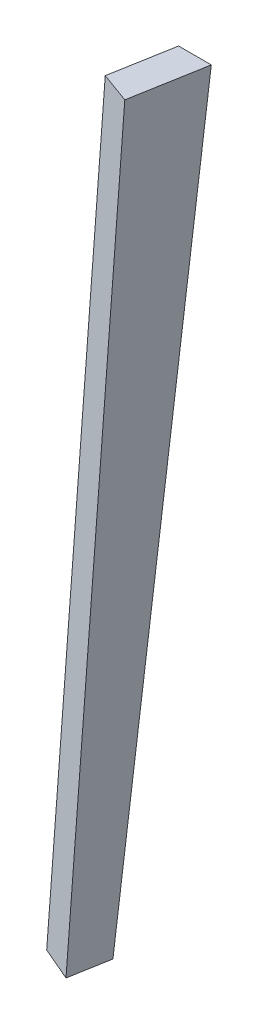
ISO-10303-21;
HEADER;
FILE_DESCRIPTION(('STEP AP214'),'2;1');
FILE_NAME('part.step','',(''),(''),'','','');
FILE_SCHEMA(('AUTOMOTIVE_DESIGN { 1 0 10303 214 1 1 1 1 }'));
ENDSEC;
DATA;
#1=APPLICATION_CONTEXT('core data for automotive mechanical design processes');
#2=APPLICATION_PROTOCOL_DEFINITION('international standard','automotive_design',2000,#1);
#3=PRODUCT_CONTEXT('',#1,'mechanical');
#4=PRODUCT('Part','Part','',(#3));
#5=PRODUCT_RELATED_PRODUCT_CATEGORY('part','',(#4));
#6=PRODUCT_DEFINITION_FORMATION('','',#4);
#7=PRODUCT_DEFINITION_CONTEXT('part definition',#1,'design');
#8=PRODUCT_DEFINITION('design','',#6,#7);
#9=PRODUCT_DEFINITION_SHAPE('','',#8);
#10=(LENGTH_UNIT() NAMED_UNIT(*) SI_UNIT(.MILLI.,.METRE.));
#11=(NAMED_UNIT(*) PLANE_ANGLE_UNIT() SI_UNIT($,.RADIAN.));
#12=(NAMED_UNIT(*) SI_UNIT($,.STERADIAN.) SOLID_ANGLE_UNIT());
#13=UNCERTAINTY_MEASURE_WITH_UNIT(LENGTH_MEASURE(1.E-05),#10,'distance_accuracy_value','');
#14=(GEOMETRIC_REPRESENTATION_CONTEXT(3) GLOBAL_UNCERTAINTY_ASSIGNED_CONTEXT((#13)) GLOBAL_UNIT_ASSIGNED_CONTEXT((#10,
#11,#12)) REPRESENTATION_CONTEXT('',''));
#15=CARTESIAN_POINT('',(0.,0.,0.));
#16=DIRECTION('',(0.,0.,1.));
#17=DIRECTION('',(1.,0.,0.));
#18=AXIS2_PLACEMENT_3D('',#15,#16,#17);
#19=CARTESIAN_POINT('',(0.,0.,0.));
#20=DIRECTION('',(0.,1.,0.));
#21=DIRECTION('',(0.,0.,1.));
#22=AXIS2_PLACEMENT_3D('',#19,#20,#21);
#23=PLANE('',#22);
#24=DIRECTION('',(0.17364817766693,0.,-0.984807753012208));
#25=VECTOR('',#24,1.);
#26=CARTESIAN_POINT('',(105.239300408618,0.,18.5565280929227));
#27=LINE('',#26,#25);
#28=CARTESIAN_POINT('',(101.967283837562,0.,37.1130561858436));
#29=VERTEX_POINT('',#28);
#30=CARTESIAN_POINT('',(108.511316979675,0.,0.));
#31=VERTEX_POINT('',#30);
#32=EDGE_CURVE('E335',#29,#31,#27,.T.);
#33=ORIENTED_EDGE('',*,*,#32,.F.);
#34=DIRECTION('',(0.939692620785915,0.,0.342020143325652));
#35=VECTOR('',#34,1.);
#36=CARTESIAN_POINT('',(0.,0.,0.));
#37=LINE('',#36,#35);
#38=CARTESIAN_POINT('',(120.270012490573,0.,43.7747046213905));
#39=VERTEX_POINT('',#38);
#40=EDGE_CURVE('E469',#29,#39,#37,.T.);
#41=ORIENTED_EDGE('',*,*,#40,.T.);
#42=DIRECTION('',(0.17364817766693,0.,-0.984807753012208));
#43=VECTOR('',#42,1.);
#44=CARTESIAN_POINT('',(120.270012490573,0.,43.7747046213928));
#45=LINE('',#44,#43);
#46=CARTESIAN_POINT('',(127.988673987868,0.,0.));
#47=VERTEX_POINT('',#46);
#48=EDGE_CURVE('E275',#39,#47,#45,.T.);
#49=ORIENTED_EDGE('',*,*,#48,.T.);
#50=DIRECTION('',(1.,0.,0.));
#51=VECTOR('',#50,1.);
#52=CARTESIAN_POINT('',(0.,0.,0.));
#53=LINE('',#52,#51);
#54=EDGE_CURVE('E466',#31,#47,#53,.T.);
#55=ORIENTED_EDGE('',*,*,#54,.F.);
#56=EDGE_LOOP('',(#33,#41,#49,#55));
#57=FACE_BOUND('',#56,.T.);
#58=ADVANCED_FACE('F270',(#57),#23,.T.);
#59=CARTESIAN_POINT('',(65.2241459166728,-490.22,23.7396476691044));
#60=DIRECTION('',(-0.281961204181753,0.358874635001233,0.889779116235657));
#61=DIRECTION('',(0.,-0.927407945093546,0.374051471561558));
#62=AXIS2_PLACEMENT_3D('',#59,#60,#61);
#63=PLANE('',#62);
#64=DIRECTION('',(-0.932643400292468,0.115073051020934,-0.341956840580265));
#65=VECTOR('',#64,1.);
#66=CARTESIAN_POINT('',(65.2241459166728,-490.22,23.7396476691044));
#67=LINE('',#66,#65);
#68=CARTESIAN_POINT('',(65.2241459166727,-490.22,23.7396476691031));
#69=VERTEX_POINT('',#68);
#70=CARTESIAN_POINT('',(47.1794403675953,-487.993576351202,17.1234956684268));
#71=VERTEX_POINT('',#70);
#72=EDGE_CURVE('E473',#69,#71,#67,.T.);
#73=ORIENTED_EDGE('',*,*,#72,.F.);
#74=DIRECTION('',(-0.934089828379049,0.109037536951291,-0.339980893660796));
#75=VECTOR('',#74,1.);
#76=CARTESIAN_POINT('',(65.2241459166728,-490.22,23.7396476691044));
#77=LINE('',#76,#75);
#78=CARTESIAN_POINT('',(47.1582170860149,-488.111140313721,17.1641873203734));
#79=VERTEX_POINT('',#78);
#80=EDGE_CURVE('E476',#69,#79,#77,.T.);
#81=ORIENTED_EDGE('',*,*,#80,.T.);
#82=DIRECTION('',(-0.16816608311874,-0.931536954726838,0.322426845139714));
#83=VECTOR('',#82,1.);
#84=CARTESIAN_POINT('',(126.83878852708,-46.7296471222864,-135.608326567175));
#85=LINE('',#84,#83);
#86=EDGE_CURVE('E328',#79,#71,#85,.F.);
#87=ORIENTED_EDGE('',*,*,#86,.T.);
#88=EDGE_LOOP('',(#73,#81,#87));
#89=FACE_BOUND('',#88,.T.);
#90=ADVANCED_FACE('F386',(#89),#63,.F.);
#91=CARTESIAN_POINT('',(50.1907524089899,-487.993576351202,0.0454964348697556));
#92=DIRECTION('',(0.0393655179455979,0.358874635001234,-0.932555281122576));
#93=DIRECTION('',(0.,0.933278686346146,0.359153022557255));
#94=AXIS2_PLACEMENT_3D('',#91,#92,#93);
#95=PLANE('',#94);
#96=DIRECTION('',(0.0477479515864214,0.931536954726839,0.360498314971858));
#97=VECTOR('',#96,1.);
#98=CARTESIAN_POINT('',(72.0727953943906,-61.0866409001997,165.255507802604));
#99=LINE('',#98,#97);
#100=CARTESIAN_POINT('',(50.1907524089899,-487.993576351202,0.0454964348697556));
#101=VERTEX_POINT('',#100);
#102=CARTESIAN_POINT('',(50.1847264125309,-488.111140313719,0.));
#103=VERTEX_POINT('',#102);
#104=EDGE_CURVE('E324',#101,#103,#99,.F.);
#105=ORIENTED_EDGE('',*,*,#104,.T.);
#106=DIRECTION('',(0.994037632856825,-0.109037536951274,0.));
#107=VECTOR('',#106,1.);
#108=CARTESIAN_POINT('',(50.1779383107974,-488.110395716263,3.5015664413135E-13));
#109=LINE('',#108,#107);
#110=CARTESIAN_POINT('',(69.4100863132487,-490.22,0.));
#111=VERTEX_POINT('',#110);
#112=EDGE_CURVE('E13',#103,#111,#109,.T.);
#113=ORIENTED_EDGE('',*,*,#112,.T.);
#114=DIRECTION('',(0.993354248705965,-0.115073051020934,-0.00235149028077553));
#115=VECTOR('',#114,1.);
#116=CARTESIAN_POINT('',(50.1907524089899,-487.993576351202,0.0454964348697556));
#117=LINE('',#116,#115);
#118=EDGE_CURVE('E326',#101,#111,#117,.T.);
#119=ORIENTED_EDGE('',*,*,#118,.F.);
#120=EDGE_LOOP('',(#105,#113,#119));
#121=FACE_BOUND('',#120,.T.);
#122=ADVANCED_FACE('F325',(#121),#95,.F.);
#123=CARTESIAN_POINT('',(109.356654261199,2.22642364879821,-3.28532778290395));
#124=DIRECTION('',(0.978058778302791,-0.116872632482846,0.172458151333541));
#125=DIRECTION('',(-0.17364817766693,0.,0.984807753012208));
#126=AXIS2_PLACEMENT_3D('',#123,#124,#125);
#127=PLANE('',#126);
#128=ORIENTED_EDGE('',*,*,#86,.F.);
#129=DIRECTION('',(-0.111494895555236,-0.992936093134445,-0.0405808232547251));
#130=VECTOR('',#129,1.);
#131=CARTESIAN_POINT('',(102.122838595063,1.38531842568085,37.1696734873746));
#132=LINE('',#131,#130);
#133=EDGE_CURVE('E337',#29,#79,#132,.T.);
#134=ORIENTED_EDGE('',*,*,#133,.F.);
#135=ORIENTED_EDGE('',*,*,#32,.T.);
#136=DIRECTION('',(-0.118650389594406,-0.992936093134445,0.));
#137=VECTOR('',#136,1.);
#138=CARTESIAN_POINT('',(108.676854895011,1.38531842568087,0.));
#139=LINE('',#138,#137);
#140=EDGE_CURVE('E320',#31,#103,#139,.T.);
#141=ORIENTED_EDGE('',*,*,#140,.T.);
#142=ORIENTED_EDGE('',*,*,#104,.F.);
#143=DIRECTION('',(0.17364817766693,0.,-0.984807753012208));
#144=VECTOR('',#143,1.);
#145=CARTESIAN_POINT('',(47.1794403675953,-487.993576351202,17.1234956684268));
#146=LINE('',#145,#144);
#147=EDGE_CURVE('E294',#71,#101,#146,.T.);
#148=ORIENTED_EDGE('',*,*,#147,.F.);
#149=EDGE_LOOP('',(#128,#134,#135,#141,#142,#148));
#150=FACE_BOUND('',#149,.T.);
#151=ADVANCED_FACE('F332',(#150),#127,.F.);
#152=CARTESIAN_POINT('',(127.988673987868,0.,0.));
#153=DIRECTION('',(0.978058778302791,-0.116872632482846,0.172458151333541));
#154=DIRECTION('',(-0.17364817766693,0.,0.984807753012208));
#155=AXIS2_PLACEMENT_3D('',#152,#153,#154);
#156=PLANE('',#155);
#157=CARTESIAN_POINT('',(120.270012490573,0.,43.7747046213928));
#158=CARTESIAN_POINT('',(101.255896230158,-169.333333333333,36.8541322717249));
#159=CARTESIAN_POINT('',(82.2417799697437,-338.666666666667,29.9335599220571));
#160=CARTESIAN_POINT('',(63.2276637093293,-508.,23.0129875723892));
#161=B_SPLINE_CURVE_WITH_KNOTS('',3,(#157,#158,#159,#160),.UNSPECIFIED.,.F.,.F.,(4,4),(0.,1.),.UNSPECIFIED.);
#162=EDGE_CURVE('E350',#39,#69,#161,.T.);
#163=ORIENTED_EDGE('',*,*,#162,.T.);
#164=DIRECTION('',(0.17364817766693,0.,-0.984807753012208));
#165=VECTOR('',#164,1.);
#166=CARTESIAN_POINT('',(71.1764468636083,-490.22,-10.0175284761442));
#167=LINE('',#166,#165);
#168=EDGE_CURVE('E338',#69,#111,#167,.T.);
#169=ORIENTED_EDGE('',*,*,#168,.T.);
#170=CARTESIAN_POINT('',(127.988673987868,0.,0.));
#171=CARTESIAN_POINT('',(107.754274100262,-169.333333333333,0.));
#172=CARTESIAN_POINT('',(87.5198742126559,-338.666666666667,0.));
#173=CARTESIAN_POINT('',(67.2854743250501,-508.,0.));
#174=B_SPLINE_CURVE_WITH_KNOTS('',3,(#170,#171,#172,#173),.UNSPECIFIED.,.F.,.F.,(4,4),(0.,1.),.UNSPECIFIED.);
#175=EDGE_CURVE('E287',#47,#111,#174,.T.);
#176=ORIENTED_EDGE('',*,*,#175,.F.);
#177=ORIENTED_EDGE('',*,*,#48,.F.);
#178=EDGE_LOOP('',(#163,#169,#176,#177));
#179=FACE_BOUND('',#178,.T.);
#180=ADVANCED_FACE('F272',(#179),#156,.T.);
#181=CARTESIAN_POINT('',(-55.116718081795,-475.58983172691,-9.71856448592241));
#182=DIRECTION('',(-0.115097074584053,-0.993146911477114,-0.0202947196497828));
#183=DIRECTION('',(0.993351501191125,-0.115120784749489,0.));
#184=AXIS2_PLACEMENT_3D('',#181,#182,#183);
#185=PLANE('',#184);
#186=ORIENTED_EDGE('',*,*,#168,.F.);
#187=ORIENTED_EDGE('',*,*,#72,.T.);
#188=ORIENTED_EDGE('',*,*,#147,.T.);
#189=ORIENTED_EDGE('',*,*,#118,.T.);
#190=EDGE_LOOP('',(#186,#187,#188,#189));
#191=FACE_BOUND('',#190,.T.);
#192=ADVANCED_FACE('F394',(#191),#185,.T.);
#193=CARTESIAN_POINT('',(0.,0.,0.));
#194=DIRECTION('',(-0.342020143325652,0.,0.939692620785915));
#195=DIRECTION('',(0.939692620785915,0.,0.342020143325652));
#196=AXIS2_PLACEMENT_3D('',#193,#194,#195);
#197=PLANE('',#196);
#198=ORIENTED_EDGE('',*,*,#133,.T.);
#199=ORIENTED_EDGE('',*,*,#80,.F.);
#200=ORIENTED_EDGE('',*,*,#162,.F.);
#201=ORIENTED_EDGE('',*,*,#40,.F.);
#202=EDGE_LOOP('',(#198,#199,#200,#201));
#203=FACE_BOUND('',#202,.T.);
#204=ADVANCED_FACE('F397',(#203),#197,.T.);
#205=CARTESIAN_POINT('',(0.,0.,0.));
#206=DIRECTION('',(0.,0.,1.));
#207=DIRECTION('',(1.,0.,0.));
#208=AXIS2_PLACEMENT_3D('',#205,#206,#207);
#209=PLANE('',#208);
#210=ORIENTED_EDGE('',*,*,#54,.T.);
#211=ORIENTED_EDGE('',*,*,#175,.T.);
#212=ORIENTED_EDGE('',*,*,#112,.F.);
#213=ORIENTED_EDGE('',*,*,#140,.F.);
#214=EDGE_LOOP('',(#210,#211,#212,#213));
#215=FACE_BOUND('',#214,.T.);
#216=ADVANCED_FACE('F318',(#215),#209,.F.);
#217=CLOSED_SHELL('',(#58,#90,#122,#151,#180,#192,#204,#216));
#218=MANIFOLD_SOLID_BREP('B2',#217);
#219=ADVANCED_BREP_SHAPE_REPRESENTATION('',(#18,#218),#14);
#220=SHAPE_DEFINITION_REPRESENTATION(#9,#219);
ENDSEC;
END-ISO-10303-21;
